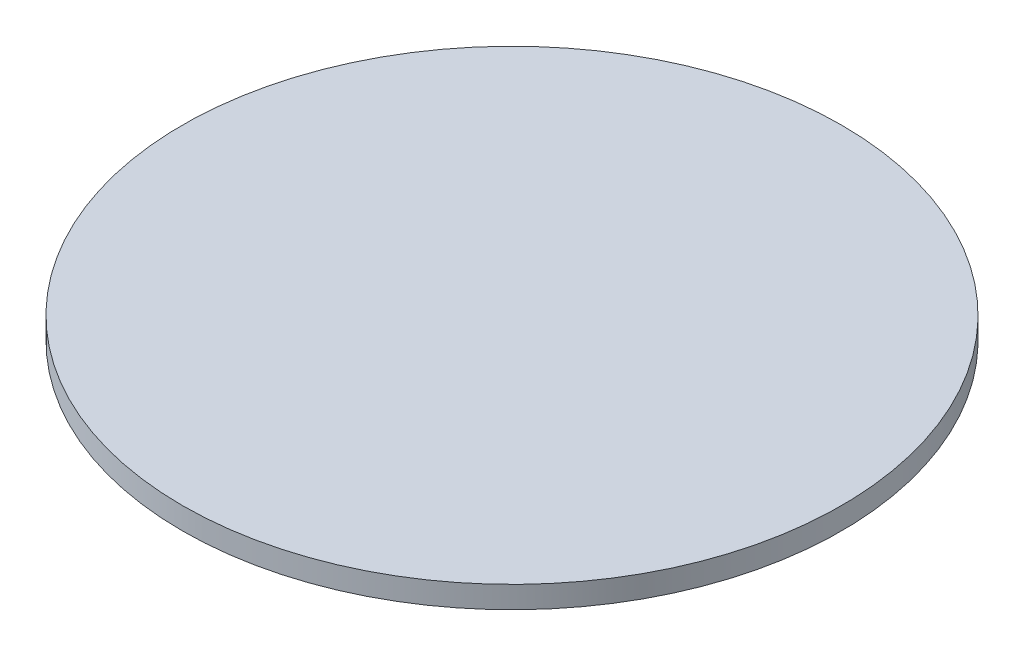
ISO-10303-21;
HEADER;
FILE_DESCRIPTION(('STEP AP214'),'2;1');
FILE_NAME('part.step','',(''),(''),'','','');
FILE_SCHEMA(('AUTOMOTIVE_DESIGN { 1 0 10303 214 1 1 1 1 }'));
ENDSEC;
DATA;
#1=APPLICATION_CONTEXT('core data for automotive mechanical design processes');
#2=APPLICATION_PROTOCOL_DEFINITION('international standard','automotive_design',2000,#1);
#3=PRODUCT_CONTEXT('',#1,'mechanical');
#4=PRODUCT('Part','Part','',(#3));
#5=PRODUCT_RELATED_PRODUCT_CATEGORY('part','',(#4));
#6=PRODUCT_DEFINITION_FORMATION('','',#4);
#7=PRODUCT_DEFINITION_CONTEXT('part definition',#1,'design');
#8=PRODUCT_DEFINITION('design','',#6,#7);
#9=PRODUCT_DEFINITION_SHAPE('','',#8);
#10=(LENGTH_UNIT() NAMED_UNIT(*) SI_UNIT(.MILLI.,.METRE.));
#11=(NAMED_UNIT(*) PLANE_ANGLE_UNIT() SI_UNIT($,.RADIAN.));
#12=(NAMED_UNIT(*) SI_UNIT($,.STERADIAN.) SOLID_ANGLE_UNIT());
#13=UNCERTAINTY_MEASURE_WITH_UNIT(LENGTH_MEASURE(1.E-05),#10,'distance_accuracy_value','');
#14=(GEOMETRIC_REPRESENTATION_CONTEXT(3) GLOBAL_UNCERTAINTY_ASSIGNED_CONTEXT((#13)) GLOBAL_UNIT_ASSIGNED_CONTEXT((#10,
#11,#12)) REPRESENTATION_CONTEXT('',''));
#15=CARTESIAN_POINT('',(0.,0.,0.));
#16=DIRECTION('',(0.,0.,1.));
#17=DIRECTION('',(1.,0.,0.));
#18=AXIS2_PLACEMENT_3D('',#15,#16,#17);
#19=CARTESIAN_POINT('',(0.,2.54,0.));
#20=DIRECTION('',(0.,-1.,0.));
#21=DIRECTION('',(0.,0.,-1.));
#22=AXIS2_PLACEMENT_3D('',#19,#20,#21);
#23=CYLINDRICAL_SURFACE('',#22,38.1);
#24=CARTESIAN_POINT('',(0.,2.54,0.));
#25=DIRECTION('',(0.,1.,0.));
#26=DIRECTION('',(0.,0.,1.));
#27=AXIS2_PLACEMENT_3D('',#24,#25,#26);
#28=CIRCLE('',#27,38.1);
#29=CARTESIAN_POINT('',(0.,2.54,38.1));
#30=VERTEX_POINT('',#29);
#31=EDGE_CURVE('E10',#30,#30,#28,.T.);
#32=ORIENTED_EDGE('',*,*,#31,.F.);
#33=EDGE_LOOP('',(#32));
#34=FACE_BOUND('',#33,.T.);
#35=CARTESIAN_POINT('',(0.,0.,0.));
#36=DIRECTION('',(0.,1.,0.));
#37=DIRECTION('',(0.,0.,1.));
#38=AXIS2_PLACEMENT_3D('',#35,#36,#37);
#39=CIRCLE('',#38,38.1);
#40=CARTESIAN_POINT('',(0.,0.,38.1));
#41=VERTEX_POINT('',#40);
#42=EDGE_CURVE('E36',#41,#41,#39,.T.);
#43=ORIENTED_EDGE('',*,*,#42,.T.);
#44=EDGE_LOOP('',(#43));
#45=FACE_BOUND('',#44,.T.);
#46=ADVANCED_FACE('F33',(#34,#45),#23,.T.);
#47=CARTESIAN_POINT('',(0.,2.54,0.));
#48=DIRECTION('',(0.,1.,0.));
#49=DIRECTION('',(0.,0.,1.));
#50=AXIS2_PLACEMENT_3D('',#47,#48,#49);
#51=PLANE('',#50);
#52=ORIENTED_EDGE('',*,*,#31,.T.);
#53=EDGE_LOOP('',(#52));
#54=FACE_BOUND('',#53,.T.);
#55=ADVANCED_FACE('F48',(#54),#51,.T.);
#56=CARTESIAN_POINT('',(0.,0.,0.));
#57=DIRECTION('',(0.,1.,0.));
#58=DIRECTION('',(0.,0.,1.));
#59=AXIS2_PLACEMENT_3D('',#56,#57,#58);
#60=PLANE('',#59);
#61=ORIENTED_EDGE('',*,*,#42,.F.);
#62=EDGE_LOOP('',(#61));
#63=FACE_BOUND('',#62,.T.);
#64=ADVANCED_FACE('F46',(#63),#60,.F.);
#65=CLOSED_SHELL('',(#46,#55,#64));
#66=MANIFOLD_SOLID_BREP('B2',#65);
#67=ADVANCED_BREP_SHAPE_REPRESENTATION('',(#18,#66),#14);
#68=SHAPE_DEFINITION_REPRESENTATION(#9,#67);
ENDSEC;
END-ISO-10303-21;
